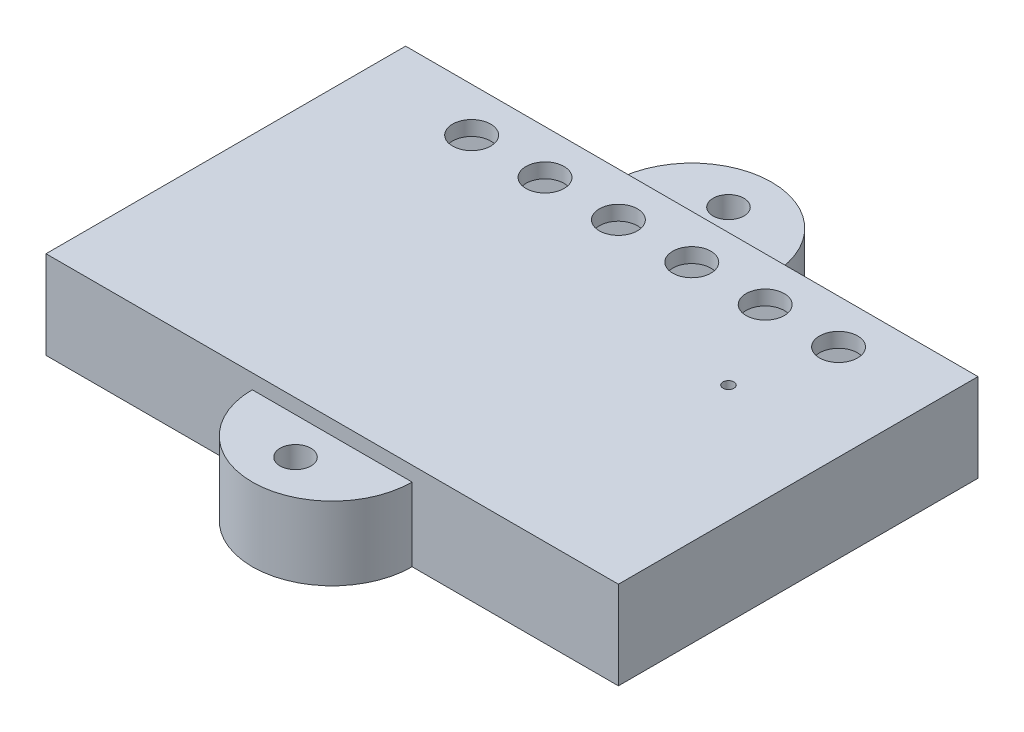
ISO-10303-21;
HEADER;
FILE_DESCRIPTION(('STEP AP214'),'2;1');
FILE_NAME('part.step','',(''),(''),'','','');
FILE_SCHEMA(('AUTOMOTIVE_DESIGN { 1 0 10303 214 1 1 1 1 }'));
ENDSEC;
DATA;
#1=APPLICATION_CONTEXT('core data for automotive mechanical design processes');
#2=APPLICATION_PROTOCOL_DEFINITION('international standard','automotive_design',2000,#1);
#3=PRODUCT_CONTEXT('',#1,'mechanical');
#4=PRODUCT('Part','Part','',(#3));
#5=PRODUCT_RELATED_PRODUCT_CATEGORY('part','',(#4));
#6=PRODUCT_DEFINITION_FORMATION('','',#4);
#7=PRODUCT_DEFINITION_CONTEXT('part definition',#1,'design');
#8=PRODUCT_DEFINITION('design','',#6,#7);
#9=PRODUCT_DEFINITION_SHAPE('','',#8);
#10=(LENGTH_UNIT() NAMED_UNIT(*) SI_UNIT(.MILLI.,.METRE.));
#11=(NAMED_UNIT(*) PLANE_ANGLE_UNIT() SI_UNIT($,.RADIAN.));
#12=(NAMED_UNIT(*) SI_UNIT($,.STERADIAN.) SOLID_ANGLE_UNIT());
#13=UNCERTAINTY_MEASURE_WITH_UNIT(LENGTH_MEASURE(1.E-05),#10,'distance_accuracy_value','');
#14=(GEOMETRIC_REPRESENTATION_CONTEXT(3) GLOBAL_UNCERTAINTY_ASSIGNED_CONTEXT((#13)) GLOBAL_UNIT_ASSIGNED_CONTEXT((#10,
#11,#12)) REPRESENTATION_CONTEXT('',''));
#15=CARTESIAN_POINT('',(0.,0.,0.));
#16=DIRECTION('',(0.,0.,1.));
#17=DIRECTION('',(1.,0.,0.));
#18=AXIS2_PLACEMENT_3D('',#15,#16,#17);
#19=CARTESIAN_POINT('',(0.,10.,-24.5));
#20=DIRECTION('',(0.,1.,0.));
#21=DIRECTION('',(0.,0.,1.));
#22=AXIS2_PLACEMENT_3D('',#19,#20,#21);
#23=PLANE('',#22);
#24=DIRECTION('',(-1.,0.,0.));
#25=VECTOR('',#24,1.);
#26=CARTESIAN_POINT('',(-39.,10.,-24.5));
#27=LINE('',#26,#25);
#28=CARTESIAN_POINT('',(10.89,10.,-24.5));
#29=VERTEX_POINT('',#28);
#30=CARTESIAN_POINT('',(-10.89,10.,-24.5));
#31=VERTEX_POINT('',#30);
#32=EDGE_CURVE('E11',#29,#31,#27,.T.);
#33=ORIENTED_EDGE('',*,*,#32,.F.);
#34=CARTESIAN_POINT('',(0.,10.,-24.5));
#35=DIRECTION('',(0.,1.,0.));
#36=DIRECTION('',(0.,0.,1.));
#37=AXIS2_PLACEMENT_3D('',#34,#35,#36);
#38=CIRCLE('',#37,10.89);
#39=EDGE_CURVE('E238',#29,#31,#38,.T.);
#40=ORIENTED_EDGE('',*,*,#39,.T.);
#41=EDGE_LOOP('',(#33,#40));
#42=FACE_BOUND('',#41,.T.);
#43=CARTESIAN_POINT('',(0.,10.,-29.5));
#44=DIRECTION('',(0.,1.,0.));
#45=DIRECTION('',(0.,0.,1.));
#46=AXIS2_PLACEMENT_3D('',#43,#44,#45);
#47=CIRCLE('',#46,2.1);
#48=CARTESIAN_POINT('',(0.,10.,-27.4));
#49=VERTEX_POINT('',#48);
#50=EDGE_CURVE('E179',#49,#49,#47,.T.);
#51=ORIENTED_EDGE('',*,*,#50,.F.);
#52=EDGE_LOOP('',(#51));
#53=FACE_BOUND('',#52,.T.);
#54=ADVANCED_FACE('F38',(#42,#53),#23,.T.);
#55=DIRECTION('',(1.,0.,0.));
#56=VECTOR('',#55,1.);
#57=CARTESIAN_POINT('',(-39.,10.,24.5));
#58=LINE('',#57,#56);
#59=CARTESIAN_POINT('',(-10.89,10.,24.5));
#60=VERTEX_POINT('',#59);
#61=CARTESIAN_POINT('',(10.89,10.,24.5));
#62=VERTEX_POINT('',#61);
#63=EDGE_CURVE('E48',#60,#62,#58,.T.);
#64=ORIENTED_EDGE('',*,*,#63,.F.);
#65=CARTESIAN_POINT('',(0.,10.,24.5));
#66=DIRECTION('',(0.,1.,0.));
#67=DIRECTION('',(0.,0.,-1.));
#68=AXIS2_PLACEMENT_3D('',#65,#66,#67);
#69=CIRCLE('',#68,10.89);
#70=EDGE_CURVE('E235',#60,#62,#69,.T.);
#71=ORIENTED_EDGE('',*,*,#70,.T.);
#72=EDGE_LOOP('',(#64,#71));
#73=FACE_BOUND('',#72,.T.);
#74=CARTESIAN_POINT('',(0.,10.,29.5));
#75=DIRECTION('',(0.,1.,0.));
#76=DIRECTION('',(0.,0.,1.));
#77=AXIS2_PLACEMENT_3D('',#74,#75,#76);
#78=CIRCLE('',#77,2.1);
#79=CARTESIAN_POINT('',(0.,10.,31.6));
#80=VERTEX_POINT('',#79);
#81=EDGE_CURVE('E187',#80,#80,#78,.T.);
#82=ORIENTED_EDGE('',*,*,#81,.F.);
#83=EDGE_LOOP('',(#82));
#84=FACE_BOUND('',#83,.T.);
#85=ADVANCED_FACE('F301',(#73,#84),#23,.T.);
#86=CARTESIAN_POINT('',(0.,0.,-24.5));
#87=DIRECTION('',(0.,1.,0.));
#88=DIRECTION('',(0.,0.,1.));
#89=AXIS2_PLACEMENT_3D('',#86,#87,#88);
#90=PLANE('',#89);
#91=DIRECTION('',(-1.,0.,0.));
#92=VECTOR('',#91,1.);
#93=CARTESIAN_POINT('',(-39.,0.,-24.5));
#94=LINE('',#93,#92);
#95=CARTESIAN_POINT('',(-10.89,0.,-24.5));
#96=VERTEX_POINT('',#95);
#97=CARTESIAN_POINT('',(-39.,0.,-24.5));
#98=VERTEX_POINT('',#97);
#99=EDGE_CURVE('E234',#96,#98,#94,.T.);
#100=ORIENTED_EDGE('',*,*,#99,.F.);
#101=CARTESIAN_POINT('',(0.,0.,-24.5));
#102=DIRECTION('',(0.,1.,0.));
#103=DIRECTION('',(0.,0.,1.));
#104=AXIS2_PLACEMENT_3D('',#101,#102,#103);
#105=CIRCLE('',#104,10.89);
#106=CARTESIAN_POINT('',(10.89,0.,-24.5));
#107=VERTEX_POINT('',#106);
#108=EDGE_CURVE('E239',#107,#96,#105,.T.);
#109=ORIENTED_EDGE('',*,*,#108,.F.);
#110=DIRECTION('',(-1.,0.,0.));
#111=VECTOR('',#110,1.);
#112=CARTESIAN_POINT('',(10.89,0.,-24.5));
#113=LINE('',#112,#111);
#114=CARTESIAN_POINT('',(39.,0.,-24.5));
#115=VERTEX_POINT('',#114);
#116=EDGE_CURVE('E260',#115,#107,#113,.T.);
#117=ORIENTED_EDGE('',*,*,#116,.F.);
#118=DIRECTION('',(0.,0.,-1.));
#119=VECTOR('',#118,1.);
#120=CARTESIAN_POINT('',(39.,0.,-24.5));
#121=LINE('',#120,#119);
#122=CARTESIAN_POINT('',(39.,0.,24.5));
#123=VERTEX_POINT('',#122);
#124=EDGE_CURVE('E257',#123,#115,#121,.T.);
#125=ORIENTED_EDGE('',*,*,#124,.F.);
#126=DIRECTION('',(1.,0.,0.));
#127=VECTOR('',#126,1.);
#128=CARTESIAN_POINT('',(10.89,0.,24.5));
#129=LINE('',#128,#127);
#130=CARTESIAN_POINT('',(10.89,0.,24.5));
#131=VERTEX_POINT('',#130);
#132=EDGE_CURVE('E254',#131,#123,#129,.T.);
#133=ORIENTED_EDGE('',*,*,#132,.F.);
#134=CARTESIAN_POINT('',(0.,0.,24.5));
#135=DIRECTION('',(0.,1.,0.));
#136=DIRECTION('',(0.,0.,-1.));
#137=AXIS2_PLACEMENT_3D('',#134,#135,#136);
#138=CIRCLE('',#137,10.89);
#139=CARTESIAN_POINT('',(-10.89,0.,24.5));
#140=VERTEX_POINT('',#139);
#141=EDGE_CURVE('E251',#140,#131,#138,.T.);
#142=ORIENTED_EDGE('',*,*,#141,.F.);
#143=DIRECTION('',(1.,0.,0.));
#144=VECTOR('',#143,1.);
#145=CARTESIAN_POINT('',(-39.,0.,24.5));
#146=LINE('',#145,#144);
#147=CARTESIAN_POINT('',(-39.,0.,24.5));
#148=VERTEX_POINT('',#147);
#149=EDGE_CURVE('E248',#148,#140,#146,.T.);
#150=ORIENTED_EDGE('',*,*,#149,.F.);
#151=DIRECTION('',(0.,0.,1.));
#152=VECTOR('',#151,1.);
#153=CARTESIAN_POINT('',(-39.,0.,10.89));
#154=LINE('',#153,#152);
#155=EDGE_CURVE('E137',#98,#148,#154,.T.);
#156=ORIENTED_EDGE('',*,*,#155,.F.);
#157=EDGE_LOOP('',(#100,#109,#117,#125,#133,#142,#150,#156));
#158=FACE_BOUND('',#157,.T.);
#159=DIRECTION('',(0.,0.,-1.));
#160=VECTOR('',#159,1.);
#161=CARTESIAN_POINT('',(36.,0.,-21.5));
#162=LINE('',#161,#160);
#163=CARTESIAN_POINT('',(36.,0.,21.5));
#164=VERTEX_POINT('',#163);
#165=CARTESIAN_POINT('',(36.,0.,-21.5));
#166=VERTEX_POINT('',#165);
#167=EDGE_CURVE('E64',#164,#166,#162,.T.);
#168=ORIENTED_EDGE('',*,*,#167,.T.);
#169=DIRECTION('',(-1.,0.,0.));
#170=VECTOR('',#169,1.);
#171=CARTESIAN_POINT('',(-36.,0.,-21.5));
#172=LINE('',#171,#170);
#173=CARTESIAN_POINT('',(-36.,0.,-21.5));
#174=VERTEX_POINT('',#173);
#175=EDGE_CURVE('E212',#166,#174,#172,.T.);
#176=ORIENTED_EDGE('',*,*,#175,.T.);
#177=DIRECTION('',(0.,0.,1.));
#178=VECTOR('',#177,1.);
#179=CARTESIAN_POINT('',(-36.,0.,-21.5));
#180=LINE('',#179,#178);
#181=CARTESIAN_POINT('',(-36.,0.,21.5));
#182=VERTEX_POINT('',#181);
#183=EDGE_CURVE('E216',#174,#182,#180,.T.);
#184=ORIENTED_EDGE('',*,*,#183,.T.);
#185=DIRECTION('',(1.,0.,0.));
#186=VECTOR('',#185,1.);
#187=CARTESIAN_POINT('',(-36.,0.,21.5));
#188=LINE('',#187,#186);
#189=EDGE_CURVE('E199',#182,#164,#188,.T.);
#190=ORIENTED_EDGE('',*,*,#189,.T.);
#191=EDGE_LOOP('',(#168,#176,#184,#190));
#192=FACE_BOUND('',#191,.T.);
#193=CARTESIAN_POINT('',(0.,0.,29.5));
#194=DIRECTION('',(0.,1.,0.));
#195=DIRECTION('',(0.,0.,1.));
#196=AXIS2_PLACEMENT_3D('',#193,#194,#195);
#197=CIRCLE('',#196,2.1);
#198=CARTESIAN_POINT('',(0.,0.,31.6));
#199=VERTEX_POINT('',#198);
#200=EDGE_CURVE('E183',#199,#199,#197,.T.);
#201=ORIENTED_EDGE('',*,*,#200,.T.);
#202=EDGE_LOOP('',(#201));
#203=FACE_BOUND('',#202,.T.);
#204=CARTESIAN_POINT('',(0.,0.,-29.5));
#205=DIRECTION('',(0.,1.,0.));
#206=DIRECTION('',(0.,0.,1.));
#207=AXIS2_PLACEMENT_3D('',#204,#205,#206);
#208=CIRCLE('',#207,2.1);
#209=CARTESIAN_POINT('',(0.,0.,-27.4));
#210=VERTEX_POINT('',#209);
#211=EDGE_CURVE('E175',#210,#210,#208,.T.);
#212=ORIENTED_EDGE('',*,*,#211,.T.);
#213=EDGE_LOOP('',(#212));
#214=FACE_BOUND('',#213,.T.);
#215=ADVANCED_FACE('F290',(#158,#192,#203,#214),#90,.F.);
#216=CARTESIAN_POINT('',(-39.,10.,10.89));
#217=DIRECTION('',(1.,0.,0.));
#218=DIRECTION('',(0.,0.,-1.));
#219=AXIS2_PLACEMENT_3D('',#216,#217,#218);
#220=PLANE('',#219);
#221=ORIENTED_EDGE('',*,*,#155,.T.);
#222=DIRECTION('',(0.,-1.,0.));
#223=VECTOR('',#222,1.);
#224=CARTESIAN_POINT('',(-39.,10.,24.5));
#225=LINE('',#224,#223);
#226=CARTESIAN_POINT('',(-39.,12.,24.5));
#227=VERTEX_POINT('',#226);
#228=EDGE_CURVE('E132',#227,#148,#225,.T.);
#229=ORIENTED_EDGE('',*,*,#228,.F.);
#230=DIRECTION('',(0.,0.,1.));
#231=VECTOR('',#230,1.);
#232=CARTESIAN_POINT('',(-39.,12.,-24.5));
#233=LINE('',#232,#231);
#234=CARTESIAN_POINT('',(-39.,12.,-24.5));
#235=VERTEX_POINT('',#234);
#236=EDGE_CURVE('E136',#235,#227,#233,.T.);
#237=ORIENTED_EDGE('',*,*,#236,.F.);
#238=DIRECTION('',(0.,-1.,0.));
#239=VECTOR('',#238,1.);
#240=CARTESIAN_POINT('',(-39.,10.,-24.5));
#241=LINE('',#240,#239);
#242=EDGE_CURVE('E141',#235,#98,#241,.T.);
#243=ORIENTED_EDGE('',*,*,#242,.T.);
#244=EDGE_LOOP('',(#221,#229,#237,#243));
#245=FACE_BOUND('',#244,.T.);
#246=ADVANCED_FACE('F40',(#245),#220,.F.);
#247=CARTESIAN_POINT('',(0.,10.,24.5));
#248=DIRECTION('',(0.,-1.,0.));
#249=DIRECTION('',(0.,0.,-1.));
#250=AXIS2_PLACEMENT_3D('',#247,#248,#249);
#251=CYLINDRICAL_SURFACE('',#250,10.89);
#252=ORIENTED_EDGE('',*,*,#141,.T.);
#253=DIRECTION('',(0.,-1.,0.));
#254=VECTOR('',#253,1.);
#255=CARTESIAN_POINT('',(10.89,10.,24.5));
#256=LINE('',#255,#254);
#257=EDGE_CURVE('E277',#62,#131,#256,.T.);
#258=ORIENTED_EDGE('',*,*,#257,.F.);
#259=ORIENTED_EDGE('',*,*,#70,.F.);
#260=DIRECTION('',(0.,-1.,0.));
#261=VECTOR('',#260,1.);
#262=CARTESIAN_POINT('',(-10.89,10.,24.5));
#263=LINE('',#262,#261);
#264=EDGE_CURVE('E142',#60,#140,#263,.T.);
#265=ORIENTED_EDGE('',*,*,#264,.T.);
#266=EDGE_LOOP('',(#252,#258,#259,#265));
#267=FACE_BOUND('',#266,.T.);
#268=ADVANCED_FACE('F298',(#267),#251,.T.);
#269=CARTESIAN_POINT('',(10.89,10.,24.5));
#270=DIRECTION('',(0.,0.,-1.));
#271=DIRECTION('',(-1.,0.,0.));
#272=AXIS2_PLACEMENT_3D('',#269,#270,#271);
#273=PLANE('',#272);
#274=ORIENTED_EDGE('',*,*,#132,.T.);
#275=DIRECTION('',(0.,-1.,0.));
#276=VECTOR('',#275,1.);
#277=CARTESIAN_POINT('',(39.,10.,24.5));
#278=LINE('',#277,#276);
#279=CARTESIAN_POINT('',(39.,12.,24.5));
#280=VERTEX_POINT('',#279);
#281=EDGE_CURVE('E149',#280,#123,#278,.T.);
#282=ORIENTED_EDGE('',*,*,#281,.F.);
#283=DIRECTION('',(1.,0.,0.));
#284=VECTOR('',#283,1.);
#285=CARTESIAN_POINT('',(-39.,12.,24.5));
#286=LINE('',#285,#284);
#287=EDGE_CURVE('E145',#227,#280,#286,.T.);
#288=ORIENTED_EDGE('',*,*,#287,.F.);
#289=ORIENTED_EDGE('',*,*,#228,.T.);
#290=ORIENTED_EDGE('',*,*,#149,.T.);
#291=ORIENTED_EDGE('',*,*,#264,.F.);
#292=ORIENTED_EDGE('',*,*,#63,.T.);
#293=ORIENTED_EDGE('',*,*,#257,.T.);
#294=EDGE_LOOP('',(#274,#282,#288,#289,#290,#291,#292,#293));
#295=FACE_BOUND('',#294,.T.);
#296=ADVANCED_FACE('F147',(#295),#273,.F.);
#297=CARTESIAN_POINT('',(39.,10.,-24.5));
#298=DIRECTION('',(-1.,0.,0.));
#299=DIRECTION('',(0.,0.,1.));
#300=AXIS2_PLACEMENT_3D('',#297,#298,#299);
#301=PLANE('',#300);
#302=ORIENTED_EDGE('',*,*,#124,.T.);
#303=DIRECTION('',(0.,-1.,0.));
#304=VECTOR('',#303,1.);
#305=CARTESIAN_POINT('',(39.,10.,-24.5));
#306=LINE('',#305,#304);
#307=CARTESIAN_POINT('',(39.,12.,-24.5));
#308=VERTEX_POINT('',#307);
#309=EDGE_CURVE('E271',#308,#115,#306,.T.);
#310=ORIENTED_EDGE('',*,*,#309,.F.);
#311=DIRECTION('',(0.,0.,-1.));
#312=VECTOR('',#311,1.);
#313=CARTESIAN_POINT('',(39.,12.,-24.5));
#314=LINE('',#313,#312);
#315=EDGE_CURVE('E154',#280,#308,#314,.T.);
#316=ORIENTED_EDGE('',*,*,#315,.F.);
#317=ORIENTED_EDGE('',*,*,#281,.T.);
#318=EDGE_LOOP('',(#302,#310,#316,#317));
#319=FACE_BOUND('',#318,.T.);
#320=ADVANCED_FACE('F304',(#319),#301,.F.);
#321=CARTESIAN_POINT('',(10.89,10.,-24.5));
#322=DIRECTION('',(0.,0.,1.));
#323=DIRECTION('',(1.,0.,0.));
#324=AXIS2_PLACEMENT_3D('',#321,#322,#323);
#325=PLANE('',#324);
#326=ORIENTED_EDGE('',*,*,#116,.T.);
#327=DIRECTION('',(0.,-1.,0.));
#328=VECTOR('',#327,1.);
#329=CARTESIAN_POINT('',(10.89,10.,-24.5));
#330=LINE('',#329,#328);
#331=EDGE_CURVE('E267',#29,#107,#330,.T.);
#332=ORIENTED_EDGE('',*,*,#331,.F.);
#333=ORIENTED_EDGE('',*,*,#32,.T.);
#334=DIRECTION('',(0.,-1.,0.));
#335=VECTOR('',#334,1.);
#336=CARTESIAN_POINT('',(-10.89,10.,-24.5));
#337=LINE('',#336,#335);
#338=EDGE_CURVE('E242',#31,#96,#337,.T.);
#339=ORIENTED_EDGE('',*,*,#338,.T.);
#340=ORIENTED_EDGE('',*,*,#99,.T.);
#341=ORIENTED_EDGE('',*,*,#242,.F.);
#342=DIRECTION('',(-1.,0.,0.));
#343=VECTOR('',#342,1.);
#344=CARTESIAN_POINT('',(-39.,12.,-24.5));
#345=LINE('',#344,#343);
#346=EDGE_CURVE('E160',#308,#235,#345,.T.);
#347=ORIENTED_EDGE('',*,*,#346,.F.);
#348=ORIENTED_EDGE('',*,*,#309,.T.);
#349=EDGE_LOOP('',(#326,#332,#333,#339,#340,#341,#347,#348));
#350=FACE_BOUND('',#349,.T.);
#351=ADVANCED_FACE('F286',(#350),#325,.F.);
#352=CARTESIAN_POINT('',(0.,10.,-24.5));
#353=DIRECTION('',(0.,-1.,0.));
#354=DIRECTION('',(0.,0.,-1.));
#355=AXIS2_PLACEMENT_3D('',#352,#353,#354);
#356=CYLINDRICAL_SURFACE('',#355,10.89);
#357=ORIENTED_EDGE('',*,*,#108,.T.);
#358=ORIENTED_EDGE('',*,*,#338,.F.);
#359=ORIENTED_EDGE('',*,*,#39,.F.);
#360=ORIENTED_EDGE('',*,*,#331,.T.);
#361=EDGE_LOOP('',(#357,#358,#359,#360));
#362=FACE_BOUND('',#361,.T.);
#363=ADVANCED_FACE('F308',(#362),#356,.T.);
#364=CARTESIAN_POINT('',(36.,10.,-21.5));
#365=DIRECTION('',(-1.,0.,0.));
#366=DIRECTION('',(0.,0.,1.));
#367=AXIS2_PLACEMENT_3D('',#364,#365,#366);
#368=PLANE('',#367);
#369=ORIENTED_EDGE('',*,*,#167,.F.);
#370=DIRECTION('',(0.,-1.,0.));
#371=VECTOR('',#370,1.);
#372=CARTESIAN_POINT('',(36.,10.,21.5));
#373=LINE('',#372,#371);
#374=CARTESIAN_POINT('',(36.,10.,21.5));
#375=VERTEX_POINT('',#374);
#376=EDGE_CURVE('E209',#375,#164,#373,.T.);
#377=ORIENTED_EDGE('',*,*,#376,.F.);
#378=DIRECTION('',(0.,0.,-1.));
#379=VECTOR('',#378,1.);
#380=CARTESIAN_POINT('',(36.,10.,-21.5));
#381=LINE('',#380,#379);
#382=CARTESIAN_POINT('',(36.,10.,-21.5));
#383=VERTEX_POINT('',#382);
#384=EDGE_CURVE('E194',#375,#383,#381,.T.);
#385=ORIENTED_EDGE('',*,*,#384,.T.);
#386=DIRECTION('',(0.,-1.,0.));
#387=VECTOR('',#386,1.);
#388=CARTESIAN_POINT('',(36.,10.,-21.5));
#389=LINE('',#388,#387);
#390=EDGE_CURVE('E231',#383,#166,#389,.T.);
#391=ORIENTED_EDGE('',*,*,#390,.T.);
#392=EDGE_LOOP('',(#369,#377,#385,#391));
#393=FACE_BOUND('',#392,.T.);
#394=ADVANCED_FACE('F332',(#393),#368,.T.);
#395=CARTESIAN_POINT('',(-36.,10.,-21.5));
#396=DIRECTION('',(0.,0.,1.));
#397=DIRECTION('',(1.,0.,0.));
#398=AXIS2_PLACEMENT_3D('',#395,#396,#397);
#399=PLANE('',#398);
#400=ORIENTED_EDGE('',*,*,#175,.F.);
#401=ORIENTED_EDGE('',*,*,#390,.F.);
#402=DIRECTION('',(-1.,0.,0.));
#403=VECTOR('',#402,1.);
#404=CARTESIAN_POINT('',(-36.,10.,-21.5));
#405=LINE('',#404,#403);
#406=CARTESIAN_POINT('',(-36.,10.,-21.5));
#407=VERTEX_POINT('',#406);
#408=EDGE_CURVE('E198',#383,#407,#405,.T.);
#409=ORIENTED_EDGE('',*,*,#408,.T.);
#410=DIRECTION('',(0.,-1.,0.));
#411=VECTOR('',#410,1.);
#412=CARTESIAN_POINT('',(-36.,10.,-21.5));
#413=LINE('',#412,#411);
#414=EDGE_CURVE('E228',#407,#174,#413,.T.);
#415=ORIENTED_EDGE('',*,*,#414,.T.);
#416=EDGE_LOOP('',(#400,#401,#409,#415));
#417=FACE_BOUND('',#416,.T.);
#418=ADVANCED_FACE('F360',(#417),#399,.T.);
#419=CARTESIAN_POINT('',(-36.,10.,-21.5));
#420=DIRECTION('',(1.,0.,0.));
#421=DIRECTION('',(0.,0.,-1.));
#422=AXIS2_PLACEMENT_3D('',#419,#420,#421);
#423=PLANE('',#422);
#424=ORIENTED_EDGE('',*,*,#183,.F.);
#425=ORIENTED_EDGE('',*,*,#414,.F.);
#426=DIRECTION('',(0.,0.,1.));
#427=VECTOR('',#426,1.);
#428=CARTESIAN_POINT('',(-36.,10.,-21.5));
#429=LINE('',#428,#427);
#430=CARTESIAN_POINT('',(-36.,10.,21.5));
#431=VERTEX_POINT('',#430);
#432=EDGE_CURVE('E203',#407,#431,#429,.T.);
#433=ORIENTED_EDGE('',*,*,#432,.T.);
#434=DIRECTION('',(0.,-1.,0.));
#435=VECTOR('',#434,1.);
#436=CARTESIAN_POINT('',(-36.,10.,21.5));
#437=LINE('',#436,#435);
#438=EDGE_CURVE('E225',#431,#182,#437,.T.);
#439=ORIENTED_EDGE('',*,*,#438,.T.);
#440=EDGE_LOOP('',(#424,#425,#433,#439));
#441=FACE_BOUND('',#440,.T.);
#442=ADVANCED_FACE('F365',(#441),#423,.T.);
#443=CARTESIAN_POINT('',(-36.,10.,21.5));
#444=DIRECTION('',(0.,0.,-1.));
#445=DIRECTION('',(-1.,0.,0.));
#446=AXIS2_PLACEMENT_3D('',#443,#444,#445);
#447=PLANE('',#446);
#448=ORIENTED_EDGE('',*,*,#189,.F.);
#449=ORIENTED_EDGE('',*,*,#438,.F.);
#450=DIRECTION('',(1.,0.,0.));
#451=VECTOR('',#450,1.);
#452=CARTESIAN_POINT('',(-36.,10.,21.5));
#453=LINE('',#452,#451);
#454=EDGE_CURVE('E56',#431,#375,#453,.T.);
#455=ORIENTED_EDGE('',*,*,#454,.T.);
#456=ORIENTED_EDGE('',*,*,#376,.T.);
#457=EDGE_LOOP('',(#448,#449,#455,#456));
#458=FACE_BOUND('',#457,.T.);
#459=ADVANCED_FACE('F372',(#458),#447,.T.);
#460=CARTESIAN_POINT('',(0.,10.,29.5));
#461=DIRECTION('',(0.,-1.,0.));
#462=DIRECTION('',(0.,0.,-1.));
#463=AXIS2_PLACEMENT_3D('',#460,#461,#462);
#464=CYLINDRICAL_SURFACE('',#463,2.1);
#465=ORIENTED_EDGE('',*,*,#81,.T.);
#466=EDGE_LOOP('',(#465));
#467=FACE_BOUND('',#466,.T.);
#468=ORIENTED_EDGE('',*,*,#200,.F.);
#469=EDGE_LOOP('',(#468));
#470=FACE_BOUND('',#469,.T.);
#471=ADVANCED_FACE('F318',(#467,#470),#464,.F.);
#472=CARTESIAN_POINT('',(0.,10.,-29.5));
#473=DIRECTION('',(0.,-1.,0.));
#474=DIRECTION('',(0.,0.,-1.));
#475=AXIS2_PLACEMENT_3D('',#472,#473,#474);
#476=CYLINDRICAL_SURFACE('',#475,2.1);
#477=ORIENTED_EDGE('',*,*,#50,.T.);
#478=EDGE_LOOP('',(#477));
#479=FACE_BOUND('',#478,.T.);
#480=ORIENTED_EDGE('',*,*,#211,.F.);
#481=EDGE_LOOP('',(#480));
#482=FACE_BOUND('',#481,.T.);
#483=ADVANCED_FACE('F315',(#479,#482),#476,.F.);
#484=CARTESIAN_POINT('',(0.,12.,0.));
#485=DIRECTION('',(0.,1.,0.));
#486=DIRECTION('',(0.,0.,1.));
#487=AXIS2_PLACEMENT_3D('',#484,#485,#486);
#488=PLANE('',#487);
#489=CARTESIAN_POINT('',(23.,12.,-6.5));
#490=DIRECTION('',(0.,1.,0.));
#491=DIRECTION('',(0.,0.,1.));
#492=AXIS2_PLACEMENT_3D('',#489,#490,#491);
#493=CIRCLE('',#492,0.749999999999998);
#494=CARTESIAN_POINT('',(23.,12.,-5.75));
#495=VERTEX_POINT('',#494);
#496=EDGE_CURVE('E589',#495,#495,#493,.T.);
#497=ORIENTED_EDGE('',*,*,#496,.F.);
#498=EDGE_LOOP('',(#497));
#499=FACE_BOUND('',#498,.T.);
#500=CARTESIAN_POINT('',(16.,12.,-18.5));
#501=DIRECTION('',(0.,1.,0.));
#502=DIRECTION('',(0.,0.,1.));
#503=AXIS2_PLACEMENT_3D('',#500,#501,#502);
#504=CIRCLE('',#503,2.6);
#505=CARTESIAN_POINT('',(16.,12.,-15.9));
#506=VERTEX_POINT('',#505);
#507=EDGE_CURVE('E605',#506,#506,#504,.T.);
#508=ORIENTED_EDGE('',*,*,#507,.F.);
#509=EDGE_LOOP('',(#508));
#510=FACE_BOUND('',#509,.T.);
#511=CARTESIAN_POINT('',(-3.99999999999999,12.,-18.5));
#512=DIRECTION('',(0.,1.,0.));
#513=DIRECTION('',(0.,0.,1.));
#514=AXIS2_PLACEMENT_3D('',#511,#512,#513);
#515=CIRCLE('',#514,2.6);
#516=CARTESIAN_POINT('',(-3.99999999999999,12.,-15.9));
#517=VERTEX_POINT('',#516);
#518=EDGE_CURVE('E621',#517,#517,#515,.T.);
#519=ORIENTED_EDGE('',*,*,#518,.F.);
#520=EDGE_LOOP('',(#519));
#521=FACE_BOUND('',#520,.T.);
#522=CARTESIAN_POINT('',(-24.,12.,-18.5));
#523=DIRECTION('',(0.,1.,0.));
#524=DIRECTION('',(0.,0.,1.));
#525=AXIS2_PLACEMENT_3D('',#522,#523,#524);
#526=CIRCLE('',#525,2.6);
#527=CARTESIAN_POINT('',(-24.,12.,-15.9));
#528=VERTEX_POINT('',#527);
#529=EDGE_CURVE('E162',#528,#528,#526,.T.);
#530=ORIENTED_EDGE('',*,*,#529,.F.);
#531=EDGE_LOOP('',(#530));
#532=FACE_BOUND('',#531,.T.);
#533=ORIENTED_EDGE('',*,*,#236,.T.);
#534=ORIENTED_EDGE('',*,*,#287,.T.);
#535=ORIENTED_EDGE('',*,*,#315,.T.);
#536=ORIENTED_EDGE('',*,*,#346,.T.);
#537=EDGE_LOOP('',(#533,#534,#535,#536));
#538=FACE_BOUND('',#537,.T.);
#539=CARTESIAN_POINT('',(-14.,12.,-18.5));
#540=DIRECTION('',(0.,1.,0.));
#541=DIRECTION('',(0.,0.,1.));
#542=AXIS2_PLACEMENT_3D('',#539,#540,#541);
#543=CIRCLE('',#542,2.6);
#544=CARTESIAN_POINT('',(-14.,12.,-15.9));
#545=VERTEX_POINT('',#544);
#546=EDGE_CURVE('E629',#545,#545,#543,.T.);
#547=ORIENTED_EDGE('',*,*,#546,.F.);
#548=EDGE_LOOP('',(#547));
#549=FACE_BOUND('',#548,.T.);
#550=CARTESIAN_POINT('',(6.00000000000001,12.,-18.5));
#551=DIRECTION('',(0.,1.,0.));
#552=DIRECTION('',(0.,0.,1.));
#553=AXIS2_PLACEMENT_3D('',#550,#551,#552);
#554=CIRCLE('',#553,2.6);
#555=CARTESIAN_POINT('',(6.00000000000001,12.,-15.9));
#556=VERTEX_POINT('',#555);
#557=EDGE_CURVE('E613',#556,#556,#554,.T.);
#558=ORIENTED_EDGE('',*,*,#557,.F.);
#559=EDGE_LOOP('',(#558));
#560=FACE_BOUND('',#559,.T.);
#561=CARTESIAN_POINT('',(26.,12.,-18.5));
#562=DIRECTION('',(0.,1.,0.));
#563=DIRECTION('',(0.,0.,1.));
#564=AXIS2_PLACEMENT_3D('',#561,#562,#563);
#565=CIRCLE('',#564,2.6);
#566=CARTESIAN_POINT('',(26.,12.,-15.9));
#567=VERTEX_POINT('',#566);
#568=EDGE_CURVE('E596',#567,#567,#565,.T.);
#569=ORIENTED_EDGE('',*,*,#568,.F.);
#570=EDGE_LOOP('',(#569));
#571=FACE_BOUND('',#570,.T.);
#572=ADVANCED_FACE('F157',(#499,#510,#521,#532,#538,#549,#560,#571),#488,.T.);
#573=CARTESIAN_POINT('',(0.,10.,0.));
#574=DIRECTION('',(0.,1.,0.));
#575=DIRECTION('',(0.,0.,1.));
#576=AXIS2_PLACEMENT_3D('',#573,#574,#575);
#577=PLANE('',#576);
#578=CARTESIAN_POINT('',(23.,10.,-6.5));
#579=DIRECTION('',(0.,1.,0.));
#580=DIRECTION('',(0.,0.,1.));
#581=AXIS2_PLACEMENT_3D('',#578,#579,#580);
#582=CIRCLE('',#581,0.749999999999998);
#583=CARTESIAN_POINT('',(23.,10.,-5.75));
#584=VERTEX_POINT('',#583);
#585=EDGE_CURVE('E42',#584,#584,#582,.T.);
#586=ORIENTED_EDGE('',*,*,#585,.T.);
#587=EDGE_LOOP('',(#586));
#588=FACE_BOUND('',#587,.T.);
#589=ORIENTED_EDGE('',*,*,#408,.F.);
#590=ORIENTED_EDGE('',*,*,#384,.F.);
#591=ORIENTED_EDGE('',*,*,#454,.F.);
#592=ORIENTED_EDGE('',*,*,#432,.F.);
#593=EDGE_LOOP('',(#589,#590,#591,#592));
#594=FACE_BOUND('',#593,.T.);
#595=CARTESIAN_POINT('',(-24.,10.,-18.5));
#596=DIRECTION('',(0.,1.,0.));
#597=DIRECTION('',(0.,0.,1.));
#598=AXIS2_PLACEMENT_3D('',#595,#596,#597);
#599=CIRCLE('',#598,2.6);
#600=CARTESIAN_POINT('',(-24.,10.,-15.9));
#601=VERTEX_POINT('',#600);
#602=EDGE_CURVE('E168',#601,#601,#599,.T.);
#603=ORIENTED_EDGE('',*,*,#602,.T.);
#604=EDGE_LOOP('',(#603));
#605=FACE_BOUND('',#604,.T.);
#606=CARTESIAN_POINT('',(-14.,10.,-18.5));
#607=DIRECTION('',(0.,1.,0.));
#608=DIRECTION('',(0.,0.,1.));
#609=AXIS2_PLACEMENT_3D('',#606,#607,#608);
#610=CIRCLE('',#609,2.6);
#611=CARTESIAN_POINT('',(-14.,10.,-15.9));
#612=VERTEX_POINT('',#611);
#613=EDGE_CURVE('E625',#612,#612,#610,.T.);
#614=ORIENTED_EDGE('',*,*,#613,.T.);
#615=EDGE_LOOP('',(#614));
#616=FACE_BOUND('',#615,.T.);
#617=CARTESIAN_POINT('',(-3.99999999999999,10.,-18.5));
#618=DIRECTION('',(0.,1.,0.));
#619=DIRECTION('',(0.,0.,1.));
#620=AXIS2_PLACEMENT_3D('',#617,#618,#619);
#621=CIRCLE('',#620,2.6);
#622=CARTESIAN_POINT('',(-3.99999999999999,10.,-15.9));
#623=VERTEX_POINT('',#622);
#624=EDGE_CURVE('E617',#623,#623,#621,.T.);
#625=ORIENTED_EDGE('',*,*,#624,.T.);
#626=EDGE_LOOP('',(#625));
#627=FACE_BOUND('',#626,.T.);
#628=CARTESIAN_POINT('',(6.00000000000001,10.,-18.5));
#629=DIRECTION('',(0.,1.,0.));
#630=DIRECTION('',(0.,0.,1.));
#631=AXIS2_PLACEMENT_3D('',#628,#629,#630);
#632=CIRCLE('',#631,2.6);
#633=CARTESIAN_POINT('',(6.00000000000001,10.,-15.9));
#634=VERTEX_POINT('',#633);
#635=EDGE_CURVE('E609',#634,#634,#632,.T.);
#636=ORIENTED_EDGE('',*,*,#635,.T.);
#637=EDGE_LOOP('',(#636));
#638=FACE_BOUND('',#637,.T.);
#639=CARTESIAN_POINT('',(16.,10.,-18.5));
#640=DIRECTION('',(0.,1.,0.));
#641=DIRECTION('',(0.,0.,1.));
#642=AXIS2_PLACEMENT_3D('',#639,#640,#641);
#643=CIRCLE('',#642,2.6);
#644=CARTESIAN_POINT('',(16.,10.,-15.9));
#645=VERTEX_POINT('',#644);
#646=EDGE_CURVE('E603',#645,#645,#643,.T.);
#647=ORIENTED_EDGE('',*,*,#646,.T.);
#648=EDGE_LOOP('',(#647));
#649=FACE_BOUND('',#648,.T.);
#650=CARTESIAN_POINT('',(26.,10.,-18.5));
#651=DIRECTION('',(0.,1.,0.));
#652=DIRECTION('',(0.,0.,1.));
#653=AXIS2_PLACEMENT_3D('',#650,#651,#652);
#654=CIRCLE('',#653,2.6);
#655=CARTESIAN_POINT('',(26.,10.,-15.9));
#656=VERTEX_POINT('',#655);
#657=EDGE_CURVE('E593',#656,#656,#654,.T.);
#658=ORIENTED_EDGE('',*,*,#657,.T.);
#659=EDGE_LOOP('',(#658));
#660=FACE_BOUND('',#659,.T.);
#661=ADVANCED_FACE('F394',(#588,#594,#605,#616,#627,#638,#649,#660),#577,.F.);
#662=CARTESIAN_POINT('',(-24.,12.,-18.5));
#663=DIRECTION('',(0.,-1.,0.));
#664=DIRECTION('',(0.,0.,-1.));
#665=AXIS2_PLACEMENT_3D('',#662,#663,#664);
#666=CYLINDRICAL_SURFACE('',#665,2.6);
#667=ORIENTED_EDGE('',*,*,#529,.T.);
#668=EDGE_LOOP('',(#667));
#669=FACE_BOUND('',#668,.T.);
#670=ORIENTED_EDGE('',*,*,#602,.F.);
#671=EDGE_LOOP('',(#670));
#672=FACE_BOUND('',#671,.T.);
#673=ADVANCED_FACE('F401',(#669,#672),#666,.F.);
#674=CARTESIAN_POINT('',(-14.,12.,-18.5));
#675=DIRECTION('',(0.,-1.,0.));
#676=DIRECTION('',(0.,0.,-1.));
#677=AXIS2_PLACEMENT_3D('',#674,#675,#676);
#678=CYLINDRICAL_SURFACE('',#677,2.6);
#679=ORIENTED_EDGE('',*,*,#546,.T.);
#680=EDGE_LOOP('',(#679));
#681=FACE_BOUND('',#680,.T.);
#682=ORIENTED_EDGE('',*,*,#613,.F.);
#683=EDGE_LOOP('',(#682));
#684=FACE_BOUND('',#683,.T.);
#685=ADVANCED_FACE('F408',(#681,#684),#678,.F.);
#686=CARTESIAN_POINT('',(-3.99999999999999,12.,-18.5));
#687=DIRECTION('',(0.,-1.,0.));
#688=DIRECTION('',(0.,0.,-1.));
#689=AXIS2_PLACEMENT_3D('',#686,#687,#688);
#690=CYLINDRICAL_SURFACE('',#689,2.6);
#691=ORIENTED_EDGE('',*,*,#518,.T.);
#692=EDGE_LOOP('',(#691));
#693=FACE_BOUND('',#692,.T.);
#694=ORIENTED_EDGE('',*,*,#624,.F.);
#695=EDGE_LOOP('',(#694));
#696=FACE_BOUND('',#695,.T.);
#697=ADVANCED_FACE('F415',(#693,#696),#690,.F.);
#698=CARTESIAN_POINT('',(6.00000000000001,12.,-18.5));
#699=DIRECTION('',(0.,-1.,0.));
#700=DIRECTION('',(0.,0.,-1.));
#701=AXIS2_PLACEMENT_3D('',#698,#699,#700);
#702=CYLINDRICAL_SURFACE('',#701,2.6);
#703=ORIENTED_EDGE('',*,*,#557,.T.);
#704=EDGE_LOOP('',(#703));
#705=FACE_BOUND('',#704,.T.);
#706=ORIENTED_EDGE('',*,*,#635,.F.);
#707=EDGE_LOOP('',(#706));
#708=FACE_BOUND('',#707,.T.);
#709=ADVANCED_FACE('F422',(#705,#708),#702,.F.);
#710=CARTESIAN_POINT('',(16.,12.,-18.5));
#711=DIRECTION('',(0.,-1.,0.));
#712=DIRECTION('',(0.,0.,-1.));
#713=AXIS2_PLACEMENT_3D('',#710,#711,#712);
#714=CYLINDRICAL_SURFACE('',#713,2.6);
#715=ORIENTED_EDGE('',*,*,#507,.T.);
#716=EDGE_LOOP('',(#715));
#717=FACE_BOUND('',#716,.T.);
#718=ORIENTED_EDGE('',*,*,#646,.F.);
#719=EDGE_LOOP('',(#718));
#720=FACE_BOUND('',#719,.T.);
#721=ADVANCED_FACE('F429',(#717,#720),#714,.F.);
#722=CARTESIAN_POINT('',(26.,12.,-18.5));
#723=DIRECTION('',(0.,-1.,0.));
#724=DIRECTION('',(0.,0.,-1.));
#725=AXIS2_PLACEMENT_3D('',#722,#723,#724);
#726=CYLINDRICAL_SURFACE('',#725,2.6);
#727=ORIENTED_EDGE('',*,*,#568,.T.);
#728=EDGE_LOOP('',(#727));
#729=FACE_BOUND('',#728,.T.);
#730=ORIENTED_EDGE('',*,*,#657,.F.);
#731=EDGE_LOOP('',(#730));
#732=FACE_BOUND('',#731,.T.);
#733=ADVANCED_FACE('F436',(#729,#732),#726,.F.);
#734=CARTESIAN_POINT('',(23.,2.,-6.5));
#735=DIRECTION('',(0.,1.,0.));
#736=DIRECTION('',(0.,0.,1.));
#737=AXIS2_PLACEMENT_3D('',#734,#735,#736);
#738=CYLINDRICAL_SURFACE('',#737,0.749999999999998);
#739=ORIENTED_EDGE('',*,*,#496,.T.);
#740=EDGE_LOOP('',(#739));
#741=FACE_BOUND('',#740,.T.);
#742=ORIENTED_EDGE('',*,*,#585,.F.);
#743=EDGE_LOOP('',(#742));
#744=FACE_BOUND('',#743,.T.);
#745=ADVANCED_FACE('F443',(#741,#744),#738,.F.);
#746=CLOSED_SHELL('',(#54,#85,#215,#246,#268,#296,#320,#351,#363,#394,#418,#442,#459,#471,#483,
#572,#661,#673,#685,#697,#709,#721,#733,#745));
#747=MANIFOLD_SOLID_BREP('B2',#746);
#748=ADVANCED_BREP_SHAPE_REPRESENTATION('',(#18,#747),#14);
#749=SHAPE_DEFINITION_REPRESENTATION(#9,#748);
ENDSEC;
END-ISO-10303-21;
